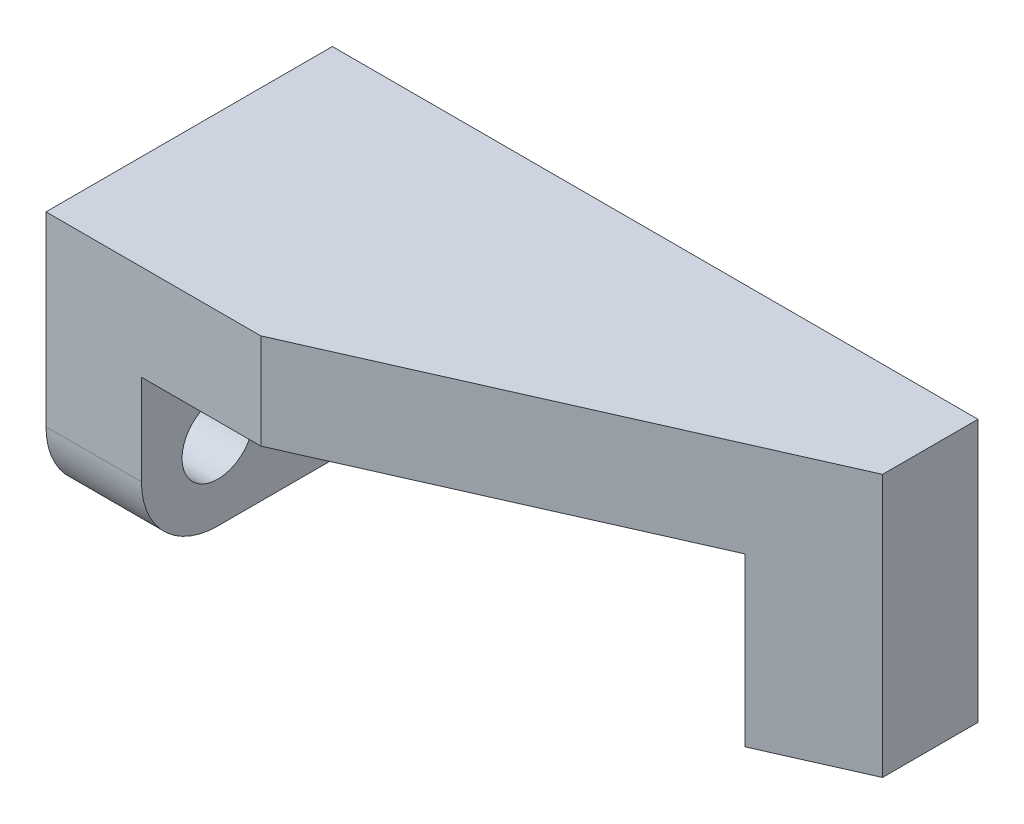
ISO-10303-21;
HEADER;
FILE_DESCRIPTION(('STEP AP214'),'2;1');
FILE_NAME('part.step','',(''),(''),'','','');
FILE_SCHEMA(('AUTOMOTIVE_DESIGN { 1 0 10303 214 1 1 1 1 }'));
ENDSEC;
DATA;
#1=APPLICATION_CONTEXT('core data for automotive mechanical design processes');
#2=APPLICATION_PROTOCOL_DEFINITION('international standard','automotive_design',2000,#1);
#3=PRODUCT_CONTEXT('',#1,'mechanical');
#4=PRODUCT('Part','Part','',(#3));
#5=PRODUCT_RELATED_PRODUCT_CATEGORY('part','',(#4));
#6=PRODUCT_DEFINITION_FORMATION('','',#4);
#7=PRODUCT_DEFINITION_CONTEXT('part definition',#1,'design');
#8=PRODUCT_DEFINITION('design','',#6,#7);
#9=PRODUCT_DEFINITION_SHAPE('','',#8);
#10=(LENGTH_UNIT() NAMED_UNIT(*) SI_UNIT(.MILLI.,.METRE.));
#11=(NAMED_UNIT(*) PLANE_ANGLE_UNIT() SI_UNIT($,.RADIAN.));
#12=(NAMED_UNIT(*) SI_UNIT($,.STERADIAN.) SOLID_ANGLE_UNIT());
#13=UNCERTAINTY_MEASURE_WITH_UNIT(LENGTH_MEASURE(1.E-05),#10,'distance_accuracy_value','');
#14=(GEOMETRIC_REPRESENTATION_CONTEXT(3) GLOBAL_UNCERTAINTY_ASSIGNED_CONTEXT((#13)) GLOBAL_UNIT_ASSIGNED_CONTEXT((#10,
#11,#12)) REPRESENTATION_CONTEXT('',''));
#15=CARTESIAN_POINT('',(0.,0.,0.));
#16=DIRECTION('',(0.,0.,1.));
#17=DIRECTION('',(1.,0.,0.));
#18=AXIS2_PLACEMENT_3D('',#15,#16,#17);
#19=CARTESIAN_POINT('',(-67.6343760997203,0.,60.));
#20=DIRECTION('',(0.,1.,0.));
#21=DIRECTION('',(-1.,0.,0.));
#22=AXIS2_PLACEMENT_3D('',#19,#20,#21);
#23=PLANE('',#22);
#24=DIRECTION('',(1.,0.,0.));
#25=VECTOR('',#24,1.);
#26=CARTESIAN_POINT('',(-67.6343760997203,0.,60.));
#27=LINE('',#26,#25);
#28=CARTESIAN_POINT('',(-67.6343760997203,0.,60.));
#29=VERTEX_POINT('',#28);
#30=CARTESIAN_POINT('',(-22.6343760997203,0.,60.));
#31=VERTEX_POINT('',#30);
#32=EDGE_CURVE('E182',#29,#31,#27,.T.);
#33=ORIENTED_EDGE('',*,*,#32,.T.);
#34=DIRECTION('',(-0.914259975958835,0.,0.405127999970072));
#35=VECTOR('',#34,1.);
#36=CARTESIAN_POINT('',(67.6343760997203,0.,20.));
#37=LINE('',#36,#35);
#38=CARTESIAN_POINT('',(67.6343760997203,0.,20.));
#39=VERTEX_POINT('',#38);
#40=EDGE_CURVE('E125',#39,#31,#37,.T.);
#41=ORIENTED_EDGE('',*,*,#40,.F.);
#42=DIRECTION('',(0.,0.,-1.));
#43=VECTOR('',#42,1.);
#44=CARTESIAN_POINT('',(67.6343760997203,0.,60.));
#45=LINE('',#44,#43);
#46=CARTESIAN_POINT('',(67.6343760997203,0.,0.));
#47=VERTEX_POINT('',#46);
#48=EDGE_CURVE('E134',#39,#47,#45,.T.);
#49=ORIENTED_EDGE('',*,*,#48,.T.);
#50=DIRECTION('',(1.,0.,0.));
#51=VECTOR('',#50,1.);
#52=CARTESIAN_POINT('',(-67.6343760997203,0.,0.));
#53=LINE('',#52,#51);
#54=CARTESIAN_POINT('',(-67.6343760997203,0.,0.));
#55=VERTEX_POINT('',#54);
#56=EDGE_CURVE('E201',#55,#47,#53,.T.);
#57=ORIENTED_EDGE('',*,*,#56,.F.);
#58=DIRECTION('',(0.,0.,-1.));
#59=VECTOR('',#58,1.);
#60=CARTESIAN_POINT('',(-67.6343760997203,0.,60.));
#61=LINE('',#60,#59);
#62=EDGE_CURVE('E157',#29,#55,#61,.T.);
#63=ORIENTED_EDGE('',*,*,#62,.F.);
#64=EDGE_LOOP('',(#33,#41,#49,#57,#63));
#65=FACE_BOUND('',#64,.T.);
#66=ADVANCED_FACE('F39',(#65),#23,.T.);
#67=CARTESIAN_POINT('',(-47.6343760997203,-20.,60.));
#68=DIRECTION('',(0.,1.,0.));
#69=DIRECTION('',(0.,0.,1.));
#70=AXIS2_PLACEMENT_3D('',#67,#68,#69);
#71=PLANE('',#70);
#72=DIRECTION('',(0.914259975958835,0.,-0.405127999970072));
#73=VECTOR('',#72,1.);
#74=CARTESIAN_POINT('',(-43.5311586907265,-20.,69.2598078878222));
#75=LINE('',#74,#73);
#76=CARTESIAN_POINT('',(-22.6343760997203,-20.,60.));
#77=VERTEX_POINT('',#76);
#78=CARTESIAN_POINT('',(47.6343760997203,-20.,28.8624244880717));
#79=VERTEX_POINT('',#78);
#80=EDGE_CURVE('E205',#77,#79,#75,.T.);
#81=ORIENTED_EDGE('',*,*,#80,.F.);
#82=DIRECTION('',(1.,0.,0.));
#83=VECTOR('',#82,1.);
#84=CARTESIAN_POINT('',(-47.6343760997203,-20.,60.));
#85=LINE('',#84,#83);
#86=CARTESIAN_POINT('',(-47.6343760997203,-20.,60.));
#87=VERTEX_POINT('',#86);
#88=EDGE_CURVE('E211',#87,#77,#85,.T.);
#89=ORIENTED_EDGE('',*,*,#88,.F.);
#90=DIRECTION('',(0.,0.,-1.));
#91=VECTOR('',#90,1.);
#92=CARTESIAN_POINT('',(-47.6343760997203,-20.,60.));
#93=LINE('',#92,#91);
#94=CARTESIAN_POINT('',(-47.6343760997203,-20.,0.));
#95=VERTEX_POINT('',#94);
#96=EDGE_CURVE('E168',#87,#95,#93,.T.);
#97=ORIENTED_EDGE('',*,*,#96,.T.);
#98=DIRECTION('',(1.,0.,0.));
#99=VECTOR('',#98,1.);
#100=CARTESIAN_POINT('',(-47.6343760997203,-20.,0.));
#101=LINE('',#100,#99);
#102=CARTESIAN_POINT('',(47.6343760997203,-20.,0.));
#103=VERTEX_POINT('',#102);
#104=EDGE_CURVE('E190',#95,#103,#101,.T.);
#105=ORIENTED_EDGE('',*,*,#104,.T.);
#106=DIRECTION('',(0.,0.,-1.));
#107=VECTOR('',#106,1.);
#108=CARTESIAN_POINT('',(47.6343760997203,-20.,60.));
#109=LINE('',#108,#107);
#110=EDGE_CURVE('E147',#79,#103,#109,.T.);
#111=ORIENTED_EDGE('',*,*,#110,.F.);
#112=EDGE_LOOP('',(#81,#89,#97,#105,#111));
#113=FACE_BOUND('',#112,.T.);
#114=ADVANCED_FACE('F260',(#113),#71,.F.);
#115=CARTESIAN_POINT('',(47.6343760997203,-20.,60.));
#116=DIRECTION('',(1.,0.,0.));
#117=DIRECTION('',(0.,0.,-1.));
#118=AXIS2_PLACEMENT_3D('',#115,#116,#117);
#119=PLANE('',#118);
#120=DIRECTION('',(0.,-1.,0.));
#121=VECTOR('',#120,1.);
#122=CARTESIAN_POINT('',(47.6343760997203,-20.,28.8624244880717));
#123=LINE('',#122,#121);
#124=CARTESIAN_POINT('',(47.6343760997203,-55.,28.8624244880717));
#125=VERTEX_POINT('',#124);
#126=EDGE_CURVE('E120',#79,#125,#123,.T.);
#127=ORIENTED_EDGE('',*,*,#126,.F.);
#128=ORIENTED_EDGE('',*,*,#110,.T.);
#129=DIRECTION('',(0.,-1.,0.));
#130=VECTOR('',#129,1.);
#131=CARTESIAN_POINT('',(47.6343760997203,-20.,0.));
#132=LINE('',#131,#130);
#133=CARTESIAN_POINT('',(47.6343760997203,-55.,0.));
#134=VERTEX_POINT('',#133);
#135=EDGE_CURVE('E193',#103,#134,#132,.T.);
#136=ORIENTED_EDGE('',*,*,#135,.T.);
#137=DIRECTION('',(0.,0.,-1.));
#138=VECTOR('',#137,1.);
#139=CARTESIAN_POINT('',(47.6343760997203,-55.,60.));
#140=LINE('',#139,#138);
#141=EDGE_CURVE('E143',#125,#134,#140,.T.);
#142=ORIENTED_EDGE('',*,*,#141,.F.);
#143=EDGE_LOOP('',(#127,#128,#136,#142));
#144=FACE_BOUND('',#143,.T.);
#145=ADVANCED_FACE('F265',(#144),#119,.F.);
#146=CARTESIAN_POINT('',(47.6343760997203,-55.,60.));
#147=DIRECTION('',(0.,1.,0.));
#148=DIRECTION('',(0.,0.,1.));
#149=AXIS2_PLACEMENT_3D('',#146,#147,#148);
#150=PLANE('',#149);
#151=DIRECTION('',(-0.914259975958835,0.,0.405127999970072));
#152=VECTOR('',#151,1.);
#153=CARTESIAN_POINT('',(67.6343760997203,-55.,20.));
#154=LINE('',#153,#152);
#155=CARTESIAN_POINT('',(67.6343760997203,-55.,20.));
#156=VERTEX_POINT('',#155);
#157=EDGE_CURVE('E114',#156,#125,#154,.T.);
#158=ORIENTED_EDGE('',*,*,#157,.T.);
#159=ORIENTED_EDGE('',*,*,#141,.T.);
#160=DIRECTION('',(1.,0.,0.));
#161=VECTOR('',#160,1.);
#162=CARTESIAN_POINT('',(47.6343760997203,-55.,0.));
#163=LINE('',#162,#161);
#164=CARTESIAN_POINT('',(67.6343760997203,-55.,0.));
#165=VERTEX_POINT('',#164);
#166=EDGE_CURVE('E140',#134,#165,#163,.T.);
#167=ORIENTED_EDGE('',*,*,#166,.T.);
#168=DIRECTION('',(0.,0.,-1.));
#169=VECTOR('',#168,1.);
#170=CARTESIAN_POINT('',(67.6343760997203,-55.,60.));
#171=LINE('',#170,#169);
#172=EDGE_CURVE('E132',#156,#165,#171,.T.);
#173=ORIENTED_EDGE('',*,*,#172,.F.);
#174=EDGE_LOOP('',(#158,#159,#167,#173));
#175=FACE_BOUND('',#174,.T.);
#176=ADVANCED_FACE('F138',(#175),#150,.F.);
#177=CARTESIAN_POINT('',(67.6343760997203,0.,60.));
#178=DIRECTION('',(1.,0.,0.));
#179=DIRECTION('',(0.,0.,-1.));
#180=AXIS2_PLACEMENT_3D('',#177,#178,#179);
#181=PLANE('',#180);
#182=ORIENTED_EDGE('',*,*,#48,.F.);
#183=DIRECTION('',(0.,-1.,0.));
#184=VECTOR('',#183,1.);
#185=CARTESIAN_POINT('',(67.6343760997203,0.,20.));
#186=LINE('',#185,#184);
#187=EDGE_CURVE('E117',#39,#156,#186,.T.);
#188=ORIENTED_EDGE('',*,*,#187,.T.);
#189=ORIENTED_EDGE('',*,*,#172,.T.);
#190=DIRECTION('',(0.,-1.,0.));
#191=VECTOR('',#190,1.);
#192=CARTESIAN_POINT('',(67.6343760997203,0.,0.));
#193=LINE('',#192,#191);
#194=EDGE_CURVE('E198',#47,#165,#193,.T.);
#195=ORIENTED_EDGE('',*,*,#194,.F.);
#196=EDGE_LOOP('',(#182,#188,#189,#195));
#197=FACE_BOUND('',#196,.T.);
#198=ADVANCED_FACE('F130',(#197),#181,.T.);
#199=CARTESIAN_POINT('',(0.,0.,60.));
#200=DIRECTION('',(0.,0.,-1.));
#201=DIRECTION('',(-1.,0.,0.));
#202=AXIS2_PLACEMENT_3D('',#199,#200,#201);
#203=PLANE('',#202);
#204=DIRECTION('',(0.,1.,0.));
#205=VECTOR('',#204,1.);
#206=CARTESIAN_POINT('',(-67.6343760997203,-55.,60.));
#207=LINE('',#206,#205);
#208=CARTESIAN_POINT('',(-67.6343760997203,-39.,60.));
#209=VERTEX_POINT('',#208);
#210=EDGE_CURVE('E149',#209,#29,#207,.T.);
#211=ORIENTED_EDGE('',*,*,#210,.F.);
#212=DIRECTION('',(-1.,0.,0.));
#213=VECTOR('',#212,1.);
#214=CARTESIAN_POINT('',(-47.6343760997203,-39.,60.));
#215=LINE('',#214,#213);
#216=CARTESIAN_POINT('',(-47.6343760997203,-39.,60.));
#217=VERTEX_POINT('',#216);
#218=EDGE_CURVE('E48',#209,#217,#215,.F.);
#219=ORIENTED_EDGE('',*,*,#218,.T.);
#220=DIRECTION('',(0.,1.,0.));
#221=VECTOR('',#220,1.);
#222=CARTESIAN_POINT('',(-47.6343760997203,-55.,60.));
#223=LINE('',#222,#221);
#224=EDGE_CURVE('E208',#217,#87,#223,.T.);
#225=ORIENTED_EDGE('',*,*,#224,.T.);
#226=ORIENTED_EDGE('',*,*,#88,.T.);
#227=DIRECTION('',(0.,-1.,0.));
#228=VECTOR('',#227,1.);
#229=CARTESIAN_POINT('',(-22.6343760997203,0.,60.));
#230=LINE('',#229,#228);
#231=EDGE_CURVE('E136',#31,#77,#230,.T.);
#232=ORIENTED_EDGE('',*,*,#231,.F.);
#233=ORIENTED_EDGE('',*,*,#32,.F.);
#234=EDGE_LOOP('',(#211,#219,#225,#226,#232,#233));
#235=FACE_BOUND('',#234,.T.);
#236=ADVANCED_FACE('F262',(#235),#203,.F.);
#237=CARTESIAN_POINT('',(-67.6343760997203,-55.,60.));
#238=DIRECTION('',(-1.,0.,0.));
#239=DIRECTION('',(0.,0.,1.));
#240=AXIS2_PLACEMENT_3D('',#237,#238,#239);
#241=PLANE('',#240);
#242=CARTESIAN_POINT('',(-67.6343760997203,-39.,44.));
#243=DIRECTION('',(-1.,0.,0.));
#244=DIRECTION('',(0.,0.,1.));
#245=AXIS2_PLACEMENT_3D('',#242,#243,#244);
#246=CIRCLE('',#245,7.5);
#247=CARTESIAN_POINT('',(-67.6343760997203,-39.,51.5));
#248=VERTEX_POINT('',#247);
#249=EDGE_CURVE('E126',#248,#248,#246,.T.);
#250=ORIENTED_EDGE('',*,*,#249,.F.);
#251=EDGE_LOOP('',(#250));
#252=FACE_BOUND('',#251,.T.);
#253=DIRECTION('',(0.,0.,-1.));
#254=VECTOR('',#253,1.);
#255=CARTESIAN_POINT('',(-67.6343760997203,-55.,60.));
#256=LINE('',#255,#254);
#257=CARTESIAN_POINT('',(-67.6343760997203,-55.,44.));
#258=VERTEX_POINT('',#257);
#259=CARTESIAN_POINT('',(-67.6343760997203,-55.,0.));
#260=VERTEX_POINT('',#259);
#261=EDGE_CURVE('E162',#258,#260,#256,.T.);
#262=ORIENTED_EDGE('',*,*,#261,.F.);
#263=CARTESIAN_POINT('',(-67.6343760997203,-39.,44.));
#264=DIRECTION('',(-1.,0.,0.));
#265=DIRECTION('',(0.,0.,1.));
#266=AXIS2_PLACEMENT_3D('',#263,#264,#265);
#267=CIRCLE('',#266,16.);
#268=EDGE_CURVE('E62',#258,#209,#267,.T.);
#269=ORIENTED_EDGE('',*,*,#268,.T.);
#270=ORIENTED_EDGE('',*,*,#210,.T.);
#271=ORIENTED_EDGE('',*,*,#62,.T.);
#272=DIRECTION('',(0.,1.,0.));
#273=VECTOR('',#272,1.);
#274=CARTESIAN_POINT('',(-67.6343760997203,-55.,0.));
#275=LINE('',#274,#273);
#276=EDGE_CURVE('E178',#260,#55,#275,.T.);
#277=ORIENTED_EDGE('',*,*,#276,.F.);
#278=EDGE_LOOP('',(#262,#269,#270,#271,#277));
#279=FACE_BOUND('',#278,.T.);
#280=ADVANCED_FACE('F251',(#252,#279),#241,.T.);
#281=CARTESIAN_POINT('',(-47.6343760997203,-55.,60.));
#282=DIRECTION('',(0.,-1.,0.));
#283=DIRECTION('',(0.,0.,-1.));
#284=AXIS2_PLACEMENT_3D('',#281,#282,#283);
#285=PLANE('',#284);
#286=DIRECTION('',(0.,0.,-1.));
#287=VECTOR('',#286,1.);
#288=CARTESIAN_POINT('',(-47.6343760997203,-55.,60.));
#289=LINE('',#288,#287);
#290=CARTESIAN_POINT('',(-47.6343760997203,-55.,44.));
#291=VERTEX_POINT('',#290);
#292=CARTESIAN_POINT('',(-47.6343760997203,-55.,0.));
#293=VERTEX_POINT('',#292);
#294=EDGE_CURVE('E165',#291,#293,#289,.T.);
#295=ORIENTED_EDGE('',*,*,#294,.F.);
#296=DIRECTION('',(-1.,0.,0.));
#297=VECTOR('',#296,1.);
#298=CARTESIAN_POINT('',(-67.6343760997203,-55.,44.));
#299=LINE('',#298,#297);
#300=EDGE_CURVE('E153',#291,#258,#299,.T.);
#301=ORIENTED_EDGE('',*,*,#300,.T.);
#302=ORIENTED_EDGE('',*,*,#261,.T.);
#303=DIRECTION('',(-1.,0.,0.));
#304=VECTOR('',#303,1.);
#305=CARTESIAN_POINT('',(-47.6343760997203,-55.,0.));
#306=LINE('',#305,#304);
#307=EDGE_CURVE('E183',#293,#260,#306,.T.);
#308=ORIENTED_EDGE('',*,*,#307,.F.);
#309=EDGE_LOOP('',(#295,#301,#302,#308));
#310=FACE_BOUND('',#309,.T.);
#311=ADVANCED_FACE('F240',(#310),#285,.T.);
#312=CARTESIAN_POINT('',(-47.6343760997203,-55.,60.));
#313=DIRECTION('',(-1.,0.,0.));
#314=DIRECTION('',(0.,0.,1.));
#315=AXIS2_PLACEMENT_3D('',#312,#313,#314);
#316=PLANE('',#315);
#317=CARTESIAN_POINT('',(-47.6343760997203,-39.,44.));
#318=DIRECTION('',(1.,0.,0.));
#319=DIRECTION('',(0.,0.,-1.));
#320=AXIS2_PLACEMENT_3D('',#317,#318,#319);
#321=CIRCLE('',#320,7.5);
#322=CARTESIAN_POINT('',(-47.6343760997203,-39.,36.5));
#323=VERTEX_POINT('',#322);
#324=EDGE_CURVE('E229',#323,#323,#321,.T.);
#325=ORIENTED_EDGE('',*,*,#324,.F.);
#326=EDGE_LOOP('',(#325));
#327=FACE_BOUND('',#326,.T.);
#328=ORIENTED_EDGE('',*,*,#224,.F.);
#329=CARTESIAN_POINT('',(-47.6343760997203,-39.,44.));
#330=DIRECTION('',(-1.,0.,0.));
#331=DIRECTION('',(0.,0.,1.));
#332=AXIS2_PLACEMENT_3D('',#329,#330,#331);
#333=CIRCLE('',#332,16.);
#334=EDGE_CURVE('E11',#217,#291,#333,.F.);
#335=ORIENTED_EDGE('',*,*,#334,.T.);
#336=ORIENTED_EDGE('',*,*,#294,.T.);
#337=DIRECTION('',(0.,1.,0.));
#338=VECTOR('',#337,1.);
#339=CARTESIAN_POINT('',(-47.6343760997203,-55.,0.));
#340=LINE('',#339,#338);
#341=EDGE_CURVE('E187',#293,#95,#340,.T.);
#342=ORIENTED_EDGE('',*,*,#341,.T.);
#343=ORIENTED_EDGE('',*,*,#96,.F.);
#344=EDGE_LOOP('',(#328,#335,#336,#342,#343));
#345=FACE_BOUND('',#344,.T.);
#346=ADVANCED_FACE('F236',(#327,#345),#316,.F.);
#347=CARTESIAN_POINT('',(0.,0.,0.));
#348=DIRECTION('',(0.,0.,-1.));
#349=DIRECTION('',(-1.,0.,0.));
#350=AXIS2_PLACEMENT_3D('',#347,#348,#349);
#351=PLANE('',#350);
#352=ORIENTED_EDGE('',*,*,#56,.T.);
#353=ORIENTED_EDGE('',*,*,#194,.T.);
#354=ORIENTED_EDGE('',*,*,#166,.F.);
#355=ORIENTED_EDGE('',*,*,#135,.F.);
#356=ORIENTED_EDGE('',*,*,#104,.F.);
#357=ORIENTED_EDGE('',*,*,#341,.F.);
#358=ORIENTED_EDGE('',*,*,#307,.T.);
#359=ORIENTED_EDGE('',*,*,#276,.T.);
#360=EDGE_LOOP('',(#352,#353,#354,#355,#356,#357,#358,#359));
#361=FACE_BOUND('',#360,.T.);
#362=ADVANCED_FACE('F239',(#361),#351,.T.);
#363=CARTESIAN_POINT('',(67.6343760997203,0.,20.));
#364=DIRECTION('',(0.405127999970072,0.,0.914259975958835));
#365=DIRECTION('',(0.914259975958835,0.,-0.405127999970072));
#366=AXIS2_PLACEMENT_3D('',#363,#364,#365);
#367=PLANE('',#366);
#368=ORIENTED_EDGE('',*,*,#80,.T.);
#369=ORIENTED_EDGE('',*,*,#126,.T.);
#370=ORIENTED_EDGE('',*,*,#157,.F.);
#371=ORIENTED_EDGE('',*,*,#187,.F.);
#372=ORIENTED_EDGE('',*,*,#40,.T.);
#373=ORIENTED_EDGE('',*,*,#231,.T.);
#374=EDGE_LOOP('',(#368,#369,#370,#371,#372,#373));
#375=FACE_BOUND('',#374,.T.);
#376=ADVANCED_FACE('F116',(#375),#367,.T.);
#377=CARTESIAN_POINT('',(-47.6343760997203,-39.,44.));
#378=DIRECTION('',(1.,0.,0.));
#379=DIRECTION('',(0.,0.,-1.));
#380=AXIS2_PLACEMENT_3D('',#377,#378,#379);
#381=CYLINDRICAL_SURFACE('',#380,16.);
#382=ORIENTED_EDGE('',*,*,#334,.F.);
#383=ORIENTED_EDGE('',*,*,#218,.F.);
#384=ORIENTED_EDGE('',*,*,#268,.F.);
#385=ORIENTED_EDGE('',*,*,#300,.F.);
#386=EDGE_LOOP('',(#382,#383,#384,#385));
#387=FACE_BOUND('',#386,.T.);
#388=ADVANCED_FACE('F41',(#387),#381,.T.);
#389=CARTESIAN_POINT('',(-147.63437609972,-39.,44.));
#390=DIRECTION('',(1.,0.,0.));
#391=DIRECTION('',(0.,0.,-1.));
#392=AXIS2_PLACEMENT_3D('',#389,#390,#391);
#393=CYLINDRICAL_SURFACE('',#392,7.5);
#394=ORIENTED_EDGE('',*,*,#249,.T.);
#395=EDGE_LOOP('',(#394));
#396=FACE_BOUND('',#395,.T.);
#397=ORIENTED_EDGE('',*,*,#324,.T.);
#398=EDGE_LOOP('',(#397));
#399=FACE_BOUND('',#398,.T.);
#400=ADVANCED_FACE('F234',(#396,#399),#393,.F.);
#401=CLOSED_SHELL('',(#66,#114,#145,#176,#198,#236,#280,#311,#346,#362,#376,#388,#400));
#402=MANIFOLD_SOLID_BREP('B2',#401);
#403=ADVANCED_BREP_SHAPE_REPRESENTATION('',(#18,#402),#14);
#404=SHAPE_DEFINITION_REPRESENTATION(#9,#403);
ENDSEC;
END-ISO-10303-21;
